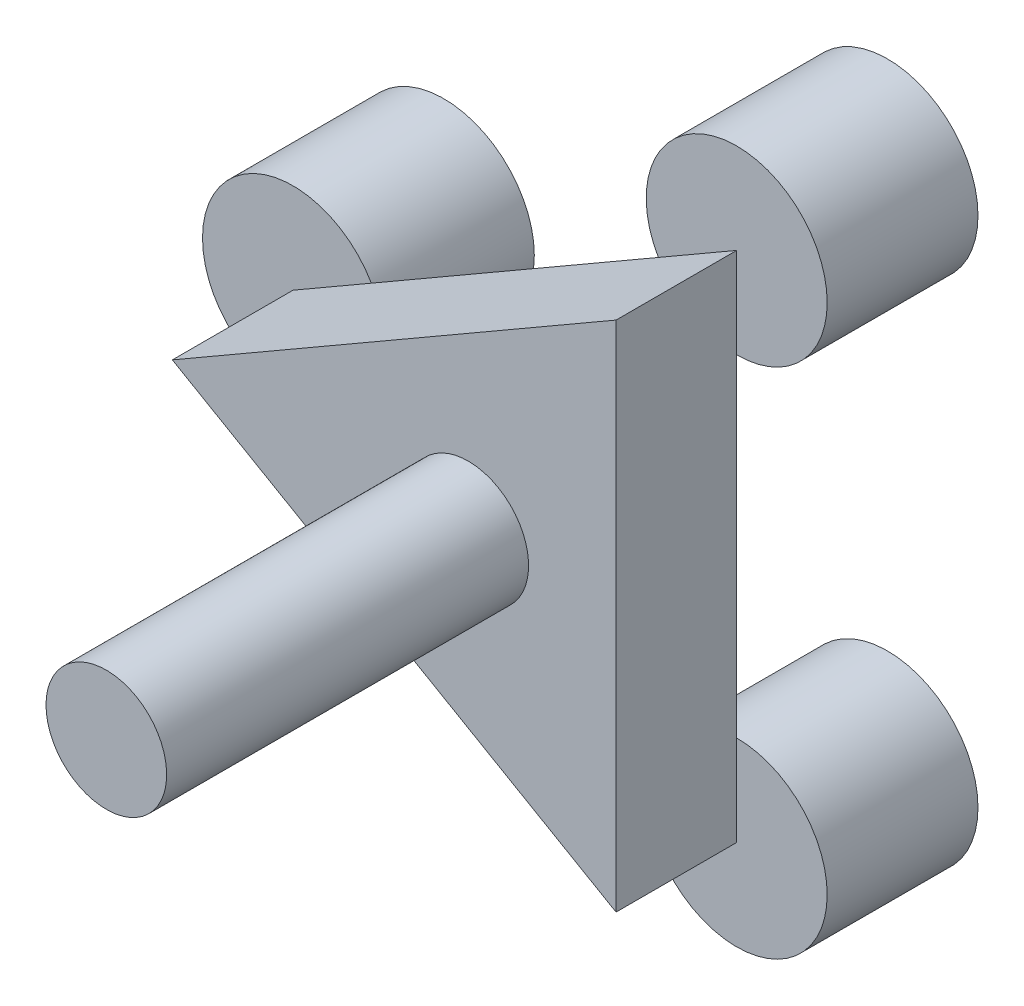
ISO-10303-21;
HEADER;
FILE_DESCRIPTION(('STEP AP214'),'2;1');
FILE_NAME('part.step','',(''),(''),'','','');
FILE_SCHEMA(('AUTOMOTIVE_DESIGN { 1 0 10303 214 1 1 1 1 }'));
ENDSEC;
DATA;
#1=APPLICATION_CONTEXT('core data for automotive mechanical design processes');
#2=APPLICATION_PROTOCOL_DEFINITION('international standard','automotive_design',2000,#1);
#3=PRODUCT_CONTEXT('',#1,'mechanical');
#4=PRODUCT('Part','Part','',(#3));
#5=PRODUCT_RELATED_PRODUCT_CATEGORY('part','',(#4));
#6=PRODUCT_DEFINITION_FORMATION('','',#4);
#7=PRODUCT_DEFINITION_CONTEXT('part definition',#1,'design');
#8=PRODUCT_DEFINITION('design','',#6,#7);
#9=PRODUCT_DEFINITION_SHAPE('','',#8);
#10=(LENGTH_UNIT() NAMED_UNIT(*) SI_UNIT(.MILLI.,.METRE.));
#11=(NAMED_UNIT(*) PLANE_ANGLE_UNIT() SI_UNIT($,.RADIAN.));
#12=(NAMED_UNIT(*) SI_UNIT($,.STERADIAN.) SOLID_ANGLE_UNIT());
#13=UNCERTAINTY_MEASURE_WITH_UNIT(LENGTH_MEASURE(1.E-05),#10,'distance_accuracy_value','');
#14=(GEOMETRIC_REPRESENTATION_CONTEXT(3) GLOBAL_UNCERTAINTY_ASSIGNED_CONTEXT((#13)) GLOBAL_UNIT_ASSIGNED_CONTEXT((#10,
#11,#12)) REPRESENTATION_CONTEXT('',''));
#15=CARTESIAN_POINT('',(0.,0.,0.));
#16=DIRECTION('',(0.,0.,1.));
#17=DIRECTION('',(1.,0.,0.));
#18=AXIS2_PLACEMENT_3D('',#15,#16,#17);
#19=CARTESIAN_POINT('',(-46.7047136723589,0.00898939408628535,-31.75));
#20=DIRECTION('',(0.,0.,1.));
#21=DIRECTION('',(1.,0.,0.));
#22=AXIS2_PLACEMENT_3D('',#19,#20,#21);
#23=CYLINDRICAL_SURFACE('',#22,19.0516618992435);
#24=CARTESIAN_POINT('',(-46.7047136723589,0.00898939408628535,-31.75));
#25=DIRECTION('',(0.,0.,1.));
#26=DIRECTION('',(1.,0.,0.));
#27=AXIS2_PLACEMENT_3D('',#24,#25,#26);
#28=CIRCLE('',#27,19.0516618992435);
#29=CARTESIAN_POINT('',(-27.6530517731154,0.00898939408628535,-31.75));
#30=VERTEX_POINT('',#29);
#31=EDGE_CURVE('E155',#30,#30,#28,.T.);
#32=ORIENTED_EDGE('',*,*,#31,.T.);
#33=EDGE_LOOP('',(#32));
#34=FACE_BOUND('',#33,.T.);
#35=CARTESIAN_POINT('',(-46.7047136723589,0.00898939408628535,0.));
#36=DIRECTION('',(0.,0.,1.));
#37=DIRECTION('',(1.,0.,0.));
#38=AXIS2_PLACEMENT_3D('',#35,#36,#37);
#39=CIRCLE('',#38,19.0516618992435);
#40=CARTESIAN_POINT('',(-30.2080028724162,9.53917060464781,0.));
#41=VERTEX_POINT('',#40);
#42=CARTESIAN_POINT('',(-30.2093782126701,-9.52357212920953,0.));
#43=VERTEX_POINT('',#42);
#44=EDGE_CURVE('E42',#41,#43,#39,.T.);
#45=ORIENTED_EDGE('',*,*,#44,.F.);
#46=EDGE_CURVE('E62',#43,#41,#39,.T.);
#47=ORIENTED_EDGE('',*,*,#46,.F.);
#48=EDGE_LOOP('',(#45,#47));
#49=FACE_BOUND('',#48,.T.);
#50=ADVANCED_FACE('F39',(#34,#49),#23,.T.);
#51=CARTESIAN_POINT('',(0.,0.,-31.75));
#52=DIRECTION('',(0.,0.,1.));
#53=DIRECTION('',(1.,0.,0.));
#54=AXIS2_PLACEMENT_3D('',#51,#52,#53);
#55=PLANE('',#54);
#56=ORIENTED_EDGE('',*,*,#31,.F.);
#57=EDGE_LOOP('',(#56));
#58=FACE_BOUND('',#57,.T.);
#59=ADVANCED_FACE('F208',(#58),#55,.F.);
#60=CARTESIAN_POINT('',(0.,0.,0.));
#61=DIRECTION('',(0.,0.,1.));
#62=DIRECTION('',(1.,0.,0.));
#63=AXIS2_PLACEMENT_3D('',#60,#61,#62);
#64=PLANE('',#63);
#65=DIRECTION('',(0.865821341304813,-0.500353280134281,0.));
#66=VECTOR('',#65,1.);
#67=CARTESIAN_POINT('',(-11.6887897404,-20.2265159699702,0.));
#68=LINE('',#67,#66);
#69=CARTESIAN_POINT('',(-46.7047136723589,0.00898939408628882,0.));
#70=VERTEX_POINT('',#69);
#71=EDGE_CURVE('E140',#70,#43,#68,.T.);
#72=ORIENTED_EDGE('',*,*,#71,.F.);
#73=DIRECTION('',(-0.865893531345828,-0.500228340234189,0.));
#74=VECTOR('',#73,1.);
#75=CARTESIAN_POINT('',(-11.6907391249597,20.2366290966542,0.));
#76=LINE('',#75,#74);
#77=EDGE_CURVE('E48',#41,#70,#76,.T.);
#78=ORIENTED_EDGE('',*,*,#77,.F.);
#79=ORIENTED_EDGE('',*,*,#44,.T.);
#80=EDGE_LOOP('',(#72,#78,#79));
#81=FACE_BOUND('',#80,.T.);
#82=ADVANCED_FACE('F171',(#81),#64,.T.);
#83=CARTESIAN_POINT('',(0.,0.,0.));
#84=DIRECTION('',(0.,0.,1.));
#85=DIRECTION('',(1.,0.,0.));
#86=AXIS2_PLACEMENT_3D('',#83,#84,#85);
#87=PLANE('',#86);
#88=DIRECTION('',(0.,1.,0.));
#89=VECTOR('',#88,1.);
#90=CARTESIAN_POINT('',(46.7063755716024,0.,0.));
#91=LINE('',#90,#89);
#92=CARTESIAN_POINT('',(46.7063755716024,-34.9227533447749,0.));
#93=VERTEX_POINT('',#92);
#94=CARTESIAN_POINT('',(46.7063755716024,34.9227533447749,0.));
#95=VERTEX_POINT('',#94);
#96=EDGE_CURVE('E115',#93,#95,#91,.T.);
#97=ORIENTED_EDGE('',*,*,#96,.F.);
#98=CARTESIAN_POINT('',(46.7063755716024,-53.9727533447749,0.));
#99=DIRECTION('',(0.,0.,1.));
#100=DIRECTION('',(1.,0.,0.));
#101=AXIS2_PLACEMENT_3D('',#98,#99,#100);
#102=CIRCLE('',#101,19.05);
#103=CARTESIAN_POINT('',(30.2124790197458,-44.4410233582168,0.));
#104=VERTEX_POINT('',#103);
#105=EDGE_CURVE('E105',#93,#104,#102,.T.);
#106=ORIENTED_EDGE('',*,*,#105,.T.);
#107=EDGE_CURVE('E145',#43,#104,#68,.T.);
#108=ORIENTED_EDGE('',*,*,#107,.F.);
#109=ORIENTED_EDGE('',*,*,#46,.T.);
#110=CARTESIAN_POINT('',(30.2111037994644,44.4434034633136,0.));
#111=VERTEX_POINT('',#110);
#112=EDGE_CURVE('E130',#111,#41,#76,.T.);
#113=ORIENTED_EDGE('',*,*,#112,.F.);
#114=CARTESIAN_POINT('',(46.7063755716024,53.9727533447749,0.));
#115=DIRECTION('',(0.,0.,1.));
#116=DIRECTION('',(1.,0.,0.));
#117=AXIS2_PLACEMENT_3D('',#114,#115,#116);
#118=CIRCLE('',#117,19.05);
#119=EDGE_CURVE('E55',#111,#95,#118,.T.);
#120=ORIENTED_EDGE('',*,*,#119,.T.);
#121=EDGE_LOOP('',(#97,#106,#108,#109,#113,#120));
#122=FACE_BOUND('',#121,.T.);
#123=ADVANCED_FACE('F116',(#122),#87,.F.);
#124=CARTESIAN_POINT('',(46.7063755716024,0.,25.4));
#125=DIRECTION('',(-1.,0.,0.));
#126=DIRECTION('',(0.,0.,1.));
#127=AXIS2_PLACEMENT_3D('',#124,#125,#126);
#128=PLANE('',#127);
#129=CARTESIAN_POINT('',(46.7063755716024,-53.9727533447749,0.));
#130=VERTEX_POINT('',#129);
#131=EDGE_CURVE('E99',#130,#93,#91,.T.);
#132=ORIENTED_EDGE('',*,*,#131,.T.);
#133=ORIENTED_EDGE('',*,*,#96,.T.);
#134=DIRECTION('',(0.,1.,0.));
#135=VECTOR('',#134,1.);
#136=CARTESIAN_POINT('',(46.7063755716024,0.,0.));
#137=LINE('',#136,#135);
#138=CARTESIAN_POINT('',(46.7063755716024,53.9727533447749,0.));
#139=VERTEX_POINT('',#138);
#140=EDGE_CURVE('E122',#95,#139,#137,.T.);
#141=ORIENTED_EDGE('',*,*,#140,.T.);
#142=DIRECTION('',(0.,0.,-1.));
#143=VECTOR('',#142,1.);
#144=CARTESIAN_POINT('',(46.7063755716024,53.9727533447749,25.4));
#145=LINE('',#144,#143);
#146=CARTESIAN_POINT('',(46.7063755716024,53.9727533447749,25.4));
#147=VERTEX_POINT('',#146);
#148=EDGE_CURVE('E152',#147,#139,#145,.T.);
#149=ORIENTED_EDGE('',*,*,#148,.F.);
#150=DIRECTION('',(0.,1.,0.));
#151=VECTOR('',#150,1.);
#152=CARTESIAN_POINT('',(46.7063755716024,0.,25.4));
#153=LINE('',#152,#151);
#154=CARTESIAN_POINT('',(46.7063755716024,-53.9727533447749,25.4));
#155=VERTEX_POINT('',#154);
#156=EDGE_CURVE('E144',#155,#147,#153,.T.);
#157=ORIENTED_EDGE('',*,*,#156,.F.);
#158=DIRECTION('',(0.,0.,-1.));
#159=VECTOR('',#158,1.);
#160=CARTESIAN_POINT('',(46.7063755716024,-53.9727533447749,25.4));
#161=LINE('',#160,#159);
#162=EDGE_CURVE('E128',#155,#130,#161,.T.);
#163=ORIENTED_EDGE('',*,*,#162,.T.);
#164=EDGE_LOOP('',(#132,#133,#141,#149,#157,#163));
#165=FACE_BOUND('',#164,.T.);
#166=ADVANCED_FACE('F125',(#165),#128,.F.);
#167=CARTESIAN_POINT('',(-11.6907391249597,20.2366290966542,25.4));
#168=DIRECTION('',(0.500228340234189,-0.865893531345828,0.));
#169=DIRECTION('',(0.865893531345828,0.500228340234189,0.));
#170=AXIS2_PLACEMENT_3D('',#167,#168,#169);
#171=PLANE('',#170);
#172=EDGE_CURVE('E132',#139,#111,#76,.T.);
#173=ORIENTED_EDGE('',*,*,#172,.T.);
#174=ORIENTED_EDGE('',*,*,#112,.T.);
#175=ORIENTED_EDGE('',*,*,#77,.T.);
#176=DIRECTION('',(0.,0.,-1.));
#177=VECTOR('',#176,1.);
#178=CARTESIAN_POINT('',(-46.7047136723589,0.00898939408628882,25.4));
#179=LINE('',#178,#177);
#180=CARTESIAN_POINT('',(-46.7047136723589,0.00898939408628882,25.4));
#181=VERTEX_POINT('',#180);
#182=EDGE_CURVE('E148',#181,#70,#179,.T.);
#183=ORIENTED_EDGE('',*,*,#182,.F.);
#184=DIRECTION('',(-0.865893531345828,-0.500228340234189,0.));
#185=VECTOR('',#184,1.);
#186=CARTESIAN_POINT('',(-11.6907391249597,20.2366290966542,25.4));
#187=LINE('',#186,#185);
#188=EDGE_CURVE('E188',#147,#181,#187,.T.);
#189=ORIENTED_EDGE('',*,*,#188,.F.);
#190=ORIENTED_EDGE('',*,*,#148,.T.);
#191=EDGE_LOOP('',(#173,#174,#175,#183,#189,#190));
#192=FACE_BOUND('',#191,.T.);
#193=ADVANCED_FACE('F173',(#192),#171,.F.);
#194=CARTESIAN_POINT('',(-11.6887897404,-20.2265159699702,25.4));
#195=DIRECTION('',(0.500353280134281,0.865821341304813,0.));
#196=DIRECTION('',(-0.865821341304813,0.500353280134281,0.));
#197=AXIS2_PLACEMENT_3D('',#194,#195,#196);
#198=PLANE('',#197);
#199=ORIENTED_EDGE('',*,*,#71,.T.);
#200=ORIENTED_EDGE('',*,*,#107,.T.);
#201=EDGE_CURVE('E101',#104,#130,#68,.T.);
#202=ORIENTED_EDGE('',*,*,#201,.T.);
#203=ORIENTED_EDGE('',*,*,#162,.F.);
#204=DIRECTION('',(0.865821341304813,-0.500353280134281,0.));
#205=VECTOR('',#204,1.);
#206=CARTESIAN_POINT('',(-11.6887897404,-20.2265159699702,25.4));
#207=LINE('',#206,#205);
#208=EDGE_CURVE('E135',#181,#155,#207,.T.);
#209=ORIENTED_EDGE('',*,*,#208,.F.);
#210=ORIENTED_EDGE('',*,*,#182,.T.);
#211=EDGE_LOOP('',(#199,#200,#202,#203,#209,#210));
#212=FACE_BOUND('',#211,.T.);
#213=ADVANCED_FACE('F168',(#212),#198,.F.);
#214=CARTESIAN_POINT('',(0.,0.,25.4));
#215=DIRECTION('',(0.,0.,1.));
#216=DIRECTION('',(1.,0.,0.));
#217=AXIS2_PLACEMENT_3D('',#214,#215,#216);
#218=PLANE('',#217);
#219=CARTESIAN_POINT('',(15.5935086840537,0.,25.4));
#220=DIRECTION('',(0.,0.,1.));
#221=DIRECTION('',(1.,0.,0.));
#222=AXIS2_PLACEMENT_3D('',#219,#220,#221);
#223=CIRCLE('',#222,12.7);
#224=CARTESIAN_POINT('',(2.89350868405374,0.,25.4));
#225=VERTEX_POINT('',#224);
#226=EDGE_CURVE('E11',#225,#225,#223,.T.);
#227=ORIENTED_EDGE('',*,*,#226,.F.);
#228=EDGE_LOOP('',(#227));
#229=FACE_BOUND('',#228,.T.);
#230=ORIENTED_EDGE('',*,*,#156,.T.);
#231=ORIENTED_EDGE('',*,*,#188,.T.);
#232=ORIENTED_EDGE('',*,*,#208,.T.);
#233=EDGE_LOOP('',(#230,#231,#232));
#234=FACE_BOUND('',#233,.T.);
#235=ADVANCED_FACE('F192',(#229,#234),#218,.T.);
#236=CARTESIAN_POINT('',(0.,0.,0.));
#237=DIRECTION('',(0.,0.,1.));
#238=DIRECTION('',(1.,0.,0.));
#239=AXIS2_PLACEMENT_3D('',#236,#237,#238);
#240=PLANE('',#239);
#241=ORIENTED_EDGE('',*,*,#140,.F.);
#242=EDGE_CURVE('E177',#95,#111,#118,.T.);
#243=ORIENTED_EDGE('',*,*,#242,.T.);
#244=ORIENTED_EDGE('',*,*,#172,.F.);
#245=EDGE_LOOP('',(#241,#243,#244));
#246=FACE_BOUND('',#245,.T.);
#247=ADVANCED_FACE('F176',(#246),#240,.T.);
#248=CARTESIAN_POINT('',(46.7063755716024,53.9727533447749,-31.75));
#249=DIRECTION('',(0.,0.,1.));
#250=DIRECTION('',(1.,0.,0.));
#251=AXIS2_PLACEMENT_3D('',#248,#249,#250);
#252=CYLINDRICAL_SURFACE('',#251,19.05);
#253=CARTESIAN_POINT('',(46.7063755716024,53.9727533447749,-31.75));
#254=DIRECTION('',(0.,0.,1.));
#255=DIRECTION('',(1.,0.,0.));
#256=AXIS2_PLACEMENT_3D('',#253,#254,#255);
#257=CIRCLE('',#256,19.05);
#258=CARTESIAN_POINT('',(65.7563755716024,53.9727533447749,-31.75));
#259=VERTEX_POINT('',#258);
#260=EDGE_CURVE('E179',#259,#259,#257,.T.);
#261=ORIENTED_EDGE('',*,*,#260,.T.);
#262=EDGE_LOOP('',(#261));
#263=FACE_BOUND('',#262,.T.);
#264=ORIENTED_EDGE('',*,*,#119,.F.);
#265=ORIENTED_EDGE('',*,*,#242,.F.);
#266=EDGE_LOOP('',(#264,#265));
#267=FACE_BOUND('',#266,.T.);
#268=ADVANCED_FACE('F201',(#263,#267),#252,.T.);
#269=CARTESIAN_POINT('',(0.,0.,-31.75));
#270=DIRECTION('',(0.,0.,1.));
#271=DIRECTION('',(1.,0.,0.));
#272=AXIS2_PLACEMENT_3D('',#269,#270,#271);
#273=PLANE('',#272);
#274=ORIENTED_EDGE('',*,*,#260,.F.);
#275=EDGE_LOOP('',(#274));
#276=FACE_BOUND('',#275,.T.);
#277=ADVANCED_FACE('F256',(#276),#273,.F.);
#278=CARTESIAN_POINT('',(0.,0.,0.));
#279=DIRECTION('',(0.,0.,1.));
#280=DIRECTION('',(1.,0.,0.));
#281=AXIS2_PLACEMENT_3D('',#278,#279,#280);
#282=PLANE('',#281);
#283=ORIENTED_EDGE('',*,*,#131,.F.);
#284=ORIENTED_EDGE('',*,*,#201,.F.);
#285=EDGE_CURVE('E95',#104,#93,#102,.T.);
#286=ORIENTED_EDGE('',*,*,#285,.T.);
#287=EDGE_LOOP('',(#283,#284,#286));
#288=FACE_BOUND('',#287,.T.);
#289=ADVANCED_FACE('F97',(#288),#282,.T.);
#290=CARTESIAN_POINT('',(46.7063755716024,-53.9727533447749,-31.75));
#291=DIRECTION('',(0.,0.,1.));
#292=DIRECTION('',(1.,0.,0.));
#293=AXIS2_PLACEMENT_3D('',#290,#291,#292);
#294=CYLINDRICAL_SURFACE('',#293,19.05);
#295=CARTESIAN_POINT('',(46.7063755716024,-53.9727533447749,-31.75));
#296=DIRECTION('',(0.,0.,1.));
#297=DIRECTION('',(1.,0.,0.));
#298=AXIS2_PLACEMENT_3D('',#295,#296,#297);
#299=CIRCLE('',#298,19.05);
#300=CARTESIAN_POINT('',(65.7563755716024,-53.9727533447749,-31.75));
#301=VERTEX_POINT('',#300);
#302=EDGE_CURVE('E114',#301,#301,#299,.T.);
#303=ORIENTED_EDGE('',*,*,#302,.T.);
#304=EDGE_LOOP('',(#303));
#305=FACE_BOUND('',#304,.T.);
#306=ORIENTED_EDGE('',*,*,#105,.F.);
#307=ORIENTED_EDGE('',*,*,#285,.F.);
#308=EDGE_LOOP('',(#306,#307));
#309=FACE_BOUND('',#308,.T.);
#310=ADVANCED_FACE('F109',(#305,#309),#294,.T.);
#311=CARTESIAN_POINT('',(0.,0.,-31.75));
#312=DIRECTION('',(0.,0.,1.));
#313=DIRECTION('',(1.,0.,0.));
#314=AXIS2_PLACEMENT_3D('',#311,#312,#313);
#315=PLANE('',#314);
#316=ORIENTED_EDGE('',*,*,#302,.F.);
#317=EDGE_LOOP('',(#316));
#318=FACE_BOUND('',#317,.T.);
#319=ADVANCED_FACE('F284',(#318),#315,.F.);
#320=CARTESIAN_POINT('',(15.5935086840537,0.,101.6));
#321=DIRECTION('',(0.,0.,-1.));
#322=DIRECTION('',(-1.,0.,0.));
#323=AXIS2_PLACEMENT_3D('',#320,#321,#322);
#324=CYLINDRICAL_SURFACE('',#323,12.7);
#325=CARTESIAN_POINT('',(15.5935086840537,0.,101.6));
#326=DIRECTION('',(0.,0.,1.));
#327=DIRECTION('',(1.,0.,0.));
#328=AXIS2_PLACEMENT_3D('',#325,#326,#327);
#329=CIRCLE('',#328,12.7);
#330=CARTESIAN_POINT('',(2.89350868405374,0.,101.6));
#331=VERTEX_POINT('',#330);
#332=EDGE_CURVE('E106',#331,#331,#329,.T.);
#333=CARTESIAN_POINT('',(2.89350868405374,0.,101.6));
#334=CARTESIAN_POINT('',(2.89350868405374,0.,100.80625));
#335=CARTESIAN_POINT('',(2.89350868405374,0.,100.0125));
#336=CARTESIAN_POINT('',(2.89350868405374,0.,98.425));
#337=CARTESIAN_POINT('',(2.89350868405374,0.,97.63125));
#338=CARTESIAN_POINT('',(2.89350868405374,0.,96.04375));
#339=CARTESIAN_POINT('',(2.89350868405374,0.,95.25));
#340=CARTESIAN_POINT('',(2.89350868405374,0.,93.6625));
#341=CARTESIAN_POINT('',(2.89350868405374,0.,92.86875));
#342=CARTESIAN_POINT('',(2.89350868405374,0.,91.28125));
#343=CARTESIAN_POINT('',(2.89350868405374,0.,90.4875));
#344=CARTESIAN_POINT('',(2.89350868405374,0.,88.9));
#345=CARTESIAN_POINT('',(2.89350868405374,0.,88.10625));
#346=CARTESIAN_POINT('',(2.89350868405374,0.,86.51875));
#347=CARTESIAN_POINT('',(2.89350868405374,0.,85.725));
#348=CARTESIAN_POINT('',(2.89350868405374,0.,84.1375));
#349=CARTESIAN_POINT('',(2.89350868405374,0.,83.34375));
#350=CARTESIAN_POINT('',(2.89350868405374,0.,81.75625));
#351=CARTESIAN_POINT('',(2.89350868405374,0.,80.9625));
#352=CARTESIAN_POINT('',(2.89350868405374,0.,79.375));
#353=CARTESIAN_POINT('',(2.89350868405374,0.,78.58125));
#354=CARTESIAN_POINT('',(2.89350868405374,0.,76.99375));
#355=CARTESIAN_POINT('',(2.89350868405374,0.,76.2));
#356=CARTESIAN_POINT('',(2.89350868405374,0.,74.6125));
#357=CARTESIAN_POINT('',(2.89350868405374,0.,73.81875));
#358=CARTESIAN_POINT('',(2.89350868405374,0.,72.23125));
#359=CARTESIAN_POINT('',(2.89350868405374,0.,71.4375));
#360=CARTESIAN_POINT('',(2.89350868405374,0.,69.85));
#361=CARTESIAN_POINT('',(2.89350868405374,0.,69.05625));
#362=CARTESIAN_POINT('',(2.89350868405374,0.,67.46875));
#363=CARTESIAN_POINT('',(2.89350868405374,0.,66.675));
#364=CARTESIAN_POINT('',(2.89350868405374,0.,65.0875));
#365=CARTESIAN_POINT('',(2.89350868405374,0.,64.29375));
#366=CARTESIAN_POINT('',(2.89350868405374,0.,62.70625));
#367=CARTESIAN_POINT('',(2.89350868405374,0.,61.9125));
#368=CARTESIAN_POINT('',(2.89350868405374,0.,60.325));
#369=CARTESIAN_POINT('',(2.89350868405374,0.,59.53125));
#370=CARTESIAN_POINT('',(2.89350868405374,0.,57.94375));
#371=CARTESIAN_POINT('',(2.89350868405374,0.,57.15));
#372=CARTESIAN_POINT('',(2.89350868405374,0.,55.5625));
#373=CARTESIAN_POINT('',(2.89350868405374,0.,54.76875));
#374=CARTESIAN_POINT('',(2.89350868405374,0.,53.18125));
#375=CARTESIAN_POINT('',(2.89350868405374,0.,52.3875));
#376=CARTESIAN_POINT('',(2.89350868405374,0.,50.8));
#377=CARTESIAN_POINT('',(2.89350868405374,0.,50.00625));
#378=CARTESIAN_POINT('',(2.89350868405374,0.,48.41875));
#379=CARTESIAN_POINT('',(2.89350868405374,0.,47.625));
#380=CARTESIAN_POINT('',(2.89350868405374,0.,46.0375));
#381=CARTESIAN_POINT('',(2.89350868405374,0.,45.24375));
#382=CARTESIAN_POINT('',(2.89350868405374,0.,43.65625));
#383=CARTESIAN_POINT('',(2.89350868405374,0.,42.8625));
#384=CARTESIAN_POINT('',(2.89350868405374,0.,41.275));
#385=CARTESIAN_POINT('',(2.89350868405374,0.,40.48125));
#386=CARTESIAN_POINT('',(2.89350868405374,0.,38.89375));
#387=CARTESIAN_POINT('',(2.89350868405374,0.,38.1));
#388=CARTESIAN_POINT('',(2.89350868405374,0.,36.5125));
#389=CARTESIAN_POINT('',(2.89350868405374,0.,35.71875));
#390=CARTESIAN_POINT('',(2.89350868405374,0.,34.13125));
#391=CARTESIAN_POINT('',(2.89350868405374,0.,33.3375));
#392=CARTESIAN_POINT('',(2.89350868405374,0.,31.75));
#393=CARTESIAN_POINT('',(2.89350868405374,0.,30.95625));
#394=CARTESIAN_POINT('',(2.89350868405374,0.,29.36875));
#395=CARTESIAN_POINT('',(2.89350868405374,0.,28.575));
#396=CARTESIAN_POINT('',(2.89350868405374,0.,26.9875));
#397=CARTESIAN_POINT('',(2.89350868405374,0.,26.19375));
#398=CARTESIAN_POINT('',(2.89350868405374,0.,25.4));
#399=B_SPLINE_CURVE_WITH_KNOTS('',3,(#333,#334,#335,#336,#337,#338,#339,#340,#341,#342,#343,
#344,#345,#346,#347,#348,#349,#350,#351,#352,#353,#354,#355,#356,#357,#358,#359,#360,#361,#362,
#363,#364,#365,#366,#367,#368,#369,#370,#371,#372,#373,#374,#375,#376,#377,#378,#379,#380,#381,
#382,#383,#384,#385,#386,#387,#388,#389,#390,#391,#392,#393,#394,#395,#396,#397,#398),
.UNSPECIFIED.,.F.,.F.,(4,2,2,2,2,2,2,2,2,2,2,2,2,2,2,2,2,2,2,2,2,2,2,2,2,2,2,2,2,2,2,2,4),(0.,
2.38124999999999,4.76249999999999,7.14374999999999,9.52499999999999,11.90625,14.2875,16.66875,
19.05,21.43125,23.8125,26.19375,28.575,30.95625,33.3375,35.71875,38.1,40.48125,42.8625,45.24375,
47.625,50.00625,52.3875,54.76875,57.15,59.53125,61.9125,64.29375,66.675,69.05625,71.4375,
73.81875,76.2),.UNSPECIFIED.);
#400=EDGE_CURVE('BSEAM293',#331,#225,#399,.T.);
#401=ORIENTED_EDGE('',*,*,#332,.F.);
#402=ORIENTED_EDGE('',*,*,#226,.T.);
#403=ORIENTED_EDGE('',*,*,#400,.T.);
#404=ORIENTED_EDGE('',*,*,#400,.F.);
#405=EDGE_LOOP('',(#401,#403,#402,#404));
#406=FACE_BOUND('',#405,.T.);
#407=ADVANCED_FACE('F293',(#406),#324,.T.);
#408=CARTESIAN_POINT('',(15.5935086840537,0.,101.6));
#409=DIRECTION('',(0.,0.,1.));
#410=DIRECTION('',(1.,0.,0.));
#411=AXIS2_PLACEMENT_3D('',#408,#409,#410);
#412=PLANE('',#411);
#413=ORIENTED_EDGE('',*,*,#332,.T.);
#414=EDGE_LOOP('',(#413));
#415=FACE_BOUND('',#414,.T.);
#416=ADVANCED_FACE('F310',(#415),#412,.T.);
#417=CLOSED_SHELL('',(#50,#59,#82,#123,#166,#193,#213,#235,#247,#268,#277,#289,#310,#319,#407,#416));
#418=MANIFOLD_SOLID_BREP('B2',#417);
#419=ADVANCED_BREP_SHAPE_REPRESENTATION('',(#18,#418),#14);
#420=SHAPE_DEFINITION_REPRESENTATION(#9,#419);
ENDSEC;
END-ISO-10303-21;
